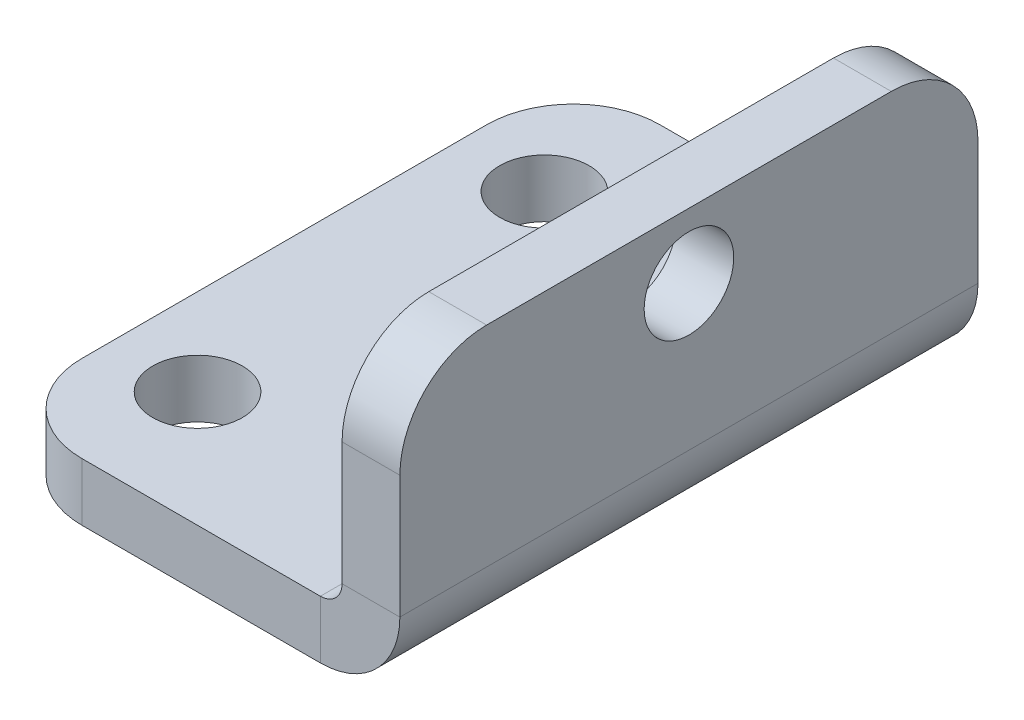
ISO-10303-21;
HEADER;
FILE_DESCRIPTION(('STEP AP214'),'2;1');
FILE_NAME('part.step','',(''),(''),'','','');
FILE_SCHEMA(('AUTOMOTIVE_DESIGN { 1 0 10303 214 1 1 1 1 }'));
ENDSEC;
DATA;
#1=APPLICATION_CONTEXT('core data for automotive mechanical design processes');
#2=APPLICATION_PROTOCOL_DEFINITION('international standard','automotive_design',2000,#1);
#3=PRODUCT_CONTEXT('',#1,'mechanical');
#4=PRODUCT('Part','Part','',(#3));
#5=PRODUCT_RELATED_PRODUCT_CATEGORY('part','',(#4));
#6=PRODUCT_DEFINITION_FORMATION('','',#4);
#7=PRODUCT_DEFINITION_CONTEXT('part definition',#1,'design');
#8=PRODUCT_DEFINITION('design','',#6,#7);
#9=PRODUCT_DEFINITION_SHAPE('','',#8);
#10=(LENGTH_UNIT() NAMED_UNIT(*) SI_UNIT(.MILLI.,.METRE.));
#11=(NAMED_UNIT(*) PLANE_ANGLE_UNIT() SI_UNIT($,.RADIAN.));
#12=(NAMED_UNIT(*) SI_UNIT($,.STERADIAN.) SOLID_ANGLE_UNIT());
#13=UNCERTAINTY_MEASURE_WITH_UNIT(LENGTH_MEASURE(1.E-05),#10,'distance_accuracy_value','');
#14=(GEOMETRIC_REPRESENTATION_CONTEXT(3) GLOBAL_UNCERTAINTY_ASSIGNED_CONTEXT((#13)) GLOBAL_UNIT_ASSIGNED_CONTEXT((#10,
#11,#12)) REPRESENTATION_CONTEXT('',''));
#15=CARTESIAN_POINT('',(0.,0.,0.));
#16=DIRECTION('',(0.,0.,1.));
#17=DIRECTION('',(1.,0.,0.));
#18=AXIS2_PLACEMENT_3D('',#15,#16,#17);
#19=CARTESIAN_POINT('',(0.,0.75,10.));
#20=DIRECTION('',(0.,0.,1.));
#21=DIRECTION('',(1.,0.,0.));
#22=AXIS2_PLACEMENT_3D('',#19,#20,#21);
#23=PLANE('',#22);
#24=DIRECTION('',(1.,0.,0.));
#25=VECTOR('',#24,1.);
#26=CARTESIAN_POINT('',(0.,0.75,10.));
#27=LINE('',#26,#25);
#28=CARTESIAN_POINT('',(0.,0.75,10.));
#29=VERTEX_POINT('',#28);
#30=CARTESIAN_POINT('',(2.,0.75,10.));
#31=VERTEX_POINT('',#30);
#32=EDGE_CURVE('E140',#29,#31,#27,.T.);
#33=ORIENTED_EDGE('',*,*,#32,.F.);
#34=CARTESIAN_POINT('',(-0.75,0.75,10.));
#35=DIRECTION('',(0.,0.,-1.));
#36=DIRECTION('',(-1.,0.,0.));
#37=AXIS2_PLACEMENT_3D('',#34,#35,#36);
#38=CIRCLE('',#37,0.75);
#39=CARTESIAN_POINT('',(-0.750000000000001,0.,10.));
#40=VERTEX_POINT('',#39);
#41=EDGE_CURVE('E144',#40,#29,#38,.F.);
#42=ORIENTED_EDGE('',*,*,#41,.F.);
#43=DIRECTION('',(0.,1.,0.));
#44=VECTOR('',#43,1.);
#45=CARTESIAN_POINT('',(-0.750000000000001,-2.,10.));
#46=LINE('',#45,#44);
#47=CARTESIAN_POINT('',(-0.750000000000001,-2.,10.));
#48=VERTEX_POINT('',#47);
#49=EDGE_CURVE('E149',#48,#40,#46,.T.);
#50=ORIENTED_EDGE('',*,*,#49,.F.);
#51=CARTESIAN_POINT('',(-0.75,0.75,10.));
#52=DIRECTION('',(0.,0.,1.));
#53=DIRECTION('',(1.,0.,0.));
#54=AXIS2_PLACEMENT_3D('',#51,#52,#53);
#55=CIRCLE('',#54,2.75);
#56=EDGE_CURVE('E146',#48,#31,#55,.T.);
#57=ORIENTED_EDGE('',*,*,#56,.T.);
#58=EDGE_LOOP('',(#33,#42,#50,#57));
#59=FACE_BOUND('',#58,.T.);
#60=ADVANCED_FACE('F49',(#59),#23,.T.);
#61=CARTESIAN_POINT('',(-0.750000000000001,-2.,10.));
#62=DIRECTION('',(0.,0.,1.));
#63=DIRECTION('',(1.,0.,0.));
#64=AXIS2_PLACEMENT_3D('',#61,#62,#63);
#65=PLANE('',#64);
#66=DIRECTION('',(0.,1.,0.));
#67=VECTOR('',#66,1.);
#68=CARTESIAN_POINT('',(2.,0.,10.));
#69=LINE('',#68,#67);
#70=CARTESIAN_POINT('',(2.,5.,10.));
#71=VERTEX_POINT('',#70);
#72=EDGE_CURVE('E167',#31,#71,#69,.T.);
#73=ORIENTED_EDGE('',*,*,#72,.T.);
#74=DIRECTION('',(1.,0.,0.));
#75=VECTOR('',#74,1.);
#76=CARTESIAN_POINT('',(-0.750000000000001,5.,10.));
#77=LINE('',#76,#75);
#78=CARTESIAN_POINT('',(0.,5.,10.));
#79=VERTEX_POINT('',#78);
#80=EDGE_CURVE('E11',#71,#79,#77,.F.);
#81=ORIENTED_EDGE('',*,*,#80,.T.);
#82=DIRECTION('',(0.,1.,0.));
#83=VECTOR('',#82,1.);
#84=CARTESIAN_POINT('',(0.,0.,10.));
#85=LINE('',#84,#83);
#86=EDGE_CURVE('E156',#29,#79,#85,.T.);
#87=ORIENTED_EDGE('',*,*,#86,.F.);
#88=ORIENTED_EDGE('',*,*,#32,.T.);
#89=EDGE_LOOP('',(#73,#81,#87,#88));
#90=FACE_BOUND('',#89,.T.);
#91=ADVANCED_FACE('F166',(#90),#65,.T.);
#92=CARTESIAN_POINT('',(-0.750000000000001,0.,-10.));
#93=DIRECTION('',(0.,0.,-1.));
#94=DIRECTION('',(-1.,0.,0.));
#95=AXIS2_PLACEMENT_3D('',#92,#93,#94);
#96=PLANE('',#95);
#97=DIRECTION('',(0.,-1.,0.));
#98=VECTOR('',#97,1.);
#99=CARTESIAN_POINT('',(-0.750000000000001,0.,-10.));
#100=LINE('',#99,#98);
#101=CARTESIAN_POINT('',(-0.750000000000001,0.,-10.));
#102=VERTEX_POINT('',#101);
#103=CARTESIAN_POINT('',(-0.750000000000001,-2.,-10.));
#104=VERTEX_POINT('',#103);
#105=EDGE_CURVE('E212',#102,#104,#100,.T.);
#106=ORIENTED_EDGE('',*,*,#105,.F.);
#107=CARTESIAN_POINT('',(-0.75,0.75,-10.));
#108=DIRECTION('',(0.,0.,-1.));
#109=DIRECTION('',(-1.,0.,0.));
#110=AXIS2_PLACEMENT_3D('',#107,#108,#109);
#111=CIRCLE('',#110,0.75);
#112=CARTESIAN_POINT('',(0.,0.75,-10.));
#113=VERTEX_POINT('',#112);
#114=EDGE_CURVE('E186',#102,#113,#111,.F.);
#115=ORIENTED_EDGE('',*,*,#114,.T.);
#116=DIRECTION('',(-1.,0.,0.));
#117=VECTOR('',#116,1.);
#118=CARTESIAN_POINT('',(2.,0.75,-10.));
#119=LINE('',#118,#117);
#120=CARTESIAN_POINT('',(2.,0.75,-10.));
#121=VERTEX_POINT('',#120);
#122=EDGE_CURVE('E210',#121,#113,#119,.T.);
#123=ORIENTED_EDGE('',*,*,#122,.F.);
#124=CARTESIAN_POINT('',(-0.75,0.75,-10.));
#125=DIRECTION('',(0.,0.,1.));
#126=DIRECTION('',(1.,0.,0.));
#127=AXIS2_PLACEMENT_3D('',#124,#125,#126);
#128=CIRCLE('',#127,2.75);
#129=EDGE_CURVE('E192',#104,#121,#128,.T.);
#130=ORIENTED_EDGE('',*,*,#129,.F.);
#131=EDGE_LOOP('',(#106,#115,#123,#130));
#132=FACE_BOUND('',#131,.T.);
#133=ADVANCED_FACE('F303',(#132),#96,.T.);
#134=CARTESIAN_POINT('',(2.,0.75,-10.));
#135=DIRECTION('',(0.,0.,-1.));
#136=DIRECTION('',(-1.,0.,0.));
#137=AXIS2_PLACEMENT_3D('',#134,#135,#136);
#138=PLANE('',#137);
#139=DIRECTION('',(1.,0.,0.));
#140=VECTOR('',#139,1.);
#141=CARTESIAN_POINT('',(-12.,-2.,-10.));
#142=LINE('',#141,#140);
#143=CARTESIAN_POINT('',(-9.,-2.,-10.));
#144=VERTEX_POINT('',#143);
#145=EDGE_CURVE('E190',#144,#104,#142,.T.);
#146=ORIENTED_EDGE('',*,*,#145,.F.);
#147=DIRECTION('',(0.,1.,0.));
#148=VECTOR('',#147,1.);
#149=CARTESIAN_POINT('',(-9.,0.75,-10.));
#150=LINE('',#149,#148);
#151=CARTESIAN_POINT('',(-9.,0.,-10.));
#152=VERTEX_POINT('',#151);
#153=EDGE_CURVE('E231',#144,#152,#150,.T.);
#154=ORIENTED_EDGE('',*,*,#153,.T.);
#155=DIRECTION('',(1.,0.,0.));
#156=VECTOR('',#155,1.);
#157=CARTESIAN_POINT('',(-12.,0.,-10.));
#158=LINE('',#157,#156);
#159=EDGE_CURVE('E188',#152,#102,#158,.T.);
#160=ORIENTED_EDGE('',*,*,#159,.T.);
#161=ORIENTED_EDGE('',*,*,#105,.T.);
#162=EDGE_LOOP('',(#146,#154,#160,#161));
#163=FACE_BOUND('',#162,.T.);
#164=ADVANCED_FACE('F371',(#163),#138,.T.);
#165=CARTESIAN_POINT('',(2.,0.,10.));
#166=DIRECTION('',(-1.,0.,0.));
#167=DIRECTION('',(0.,0.,1.));
#168=AXIS2_PLACEMENT_3D('',#165,#166,#167);
#169=PLANE('',#168);
#170=CARTESIAN_POINT('',(2.,5.74999999999999,0.));
#171=DIRECTION('',(-1.,0.,0.));
#172=DIRECTION('',(0.,0.,1.));
#173=AXIS2_PLACEMENT_3D('',#170,#171,#172);
#174=CIRCLE('',#173,1.55);
#175=CARTESIAN_POINT('',(2.,5.74999999999999,1.54999999999996));
#176=VERTEX_POINT('',#175);
#177=EDGE_CURVE('E265',#176,#176,#174,.T.);
#178=ORIENTED_EDGE('',*,*,#177,.T.);
#179=EDGE_LOOP('',(#178));
#180=FACE_BOUND('',#179,.T.);
#181=DIRECTION('',(0.,1.,0.));
#182=VECTOR('',#181,1.);
#183=CARTESIAN_POINT('',(2.,0.,-10.));
#184=LINE('',#183,#182);
#185=CARTESIAN_POINT('',(2.,5.,-10.));
#186=VERTEX_POINT('',#185);
#187=EDGE_CURVE('E181',#121,#186,#184,.T.);
#188=ORIENTED_EDGE('',*,*,#187,.T.);
#189=CARTESIAN_POINT('',(2.,5.,-7.));
#190=DIRECTION('',(-1.,0.,0.));
#191=DIRECTION('',(0.,0.,1.));
#192=AXIS2_PLACEMENT_3D('',#189,#190,#191);
#193=CIRCLE('',#192,3.);
#194=CARTESIAN_POINT('',(2.,8.,-7.));
#195=VERTEX_POINT('',#194);
#196=EDGE_CURVE('E239',#186,#195,#193,.F.);
#197=ORIENTED_EDGE('',*,*,#196,.T.);
#198=DIRECTION('',(0.,0.,-1.));
#199=VECTOR('',#198,1.);
#200=CARTESIAN_POINT('',(2.,8.,10.));
#201=LINE('',#200,#199);
#202=CARTESIAN_POINT('',(2.,8.,7.));
#203=VERTEX_POINT('',#202);
#204=EDGE_CURVE('E208',#203,#195,#201,.T.);
#205=ORIENTED_EDGE('',*,*,#204,.F.);
#206=CARTESIAN_POINT('',(2.,5.,7.));
#207=DIRECTION('',(-1.,0.,0.));
#208=DIRECTION('',(0.,0.,1.));
#209=AXIS2_PLACEMENT_3D('',#206,#207,#208);
#210=CIRCLE('',#209,3.);
#211=EDGE_CURVE('E237',#203,#71,#210,.F.);
#212=ORIENTED_EDGE('',*,*,#211,.T.);
#213=ORIENTED_EDGE('',*,*,#72,.F.);
#214=DIRECTION('',(0.,0.,-1.));
#215=VECTOR('',#214,1.);
#216=CARTESIAN_POINT('',(2.,0.75,10.));
#217=LINE('',#216,#215);
#218=EDGE_CURVE('E180',#31,#121,#217,.T.);
#219=ORIENTED_EDGE('',*,*,#218,.T.);
#220=EDGE_LOOP('',(#188,#197,#205,#212,#213,#219));
#221=FACE_BOUND('',#220,.T.);
#222=ADVANCED_FACE('F255',(#180,#221),#169,.F.);
#223=CARTESIAN_POINT('',(0.,8.,10.));
#224=DIRECTION('',(0.,1.,0.));
#225=DIRECTION('',(0.,0.,1.));
#226=AXIS2_PLACEMENT_3D('',#223,#224,#225);
#227=PLANE('',#226);
#228=ORIENTED_EDGE('',*,*,#204,.T.);
#229=DIRECTION('',(1.,0.,0.));
#230=VECTOR('',#229,1.);
#231=CARTESIAN_POINT('',(0.,8.,-7.));
#232=LINE('',#231,#230);
#233=CARTESIAN_POINT('',(0.,8.,-7.));
#234=VERTEX_POINT('',#233);
#235=EDGE_CURVE('E70',#195,#234,#232,.F.);
#236=ORIENTED_EDGE('',*,*,#235,.T.);
#237=DIRECTION('',(0.,0.,-1.));
#238=VECTOR('',#237,1.);
#239=CARTESIAN_POINT('',(0.,8.,10.));
#240=LINE('',#239,#238);
#241=CARTESIAN_POINT('',(0.,8.,7.));
#242=VERTEX_POINT('',#241);
#243=EDGE_CURVE('E163',#242,#234,#240,.T.);
#244=ORIENTED_EDGE('',*,*,#243,.F.);
#245=DIRECTION('',(1.,0.,0.));
#246=VECTOR('',#245,1.);
#247=CARTESIAN_POINT('',(0.,8.,7.));
#248=LINE('',#247,#246);
#249=EDGE_CURVE('E241',#242,#203,#248,.T.);
#250=ORIENTED_EDGE('',*,*,#249,.T.);
#251=EDGE_LOOP('',(#228,#236,#244,#250));
#252=FACE_BOUND('',#251,.T.);
#253=ADVANCED_FACE('F256',(#252),#227,.T.);
#254=CARTESIAN_POINT('',(0.,0.,10.));
#255=DIRECTION('',(-1.,0.,0.));
#256=DIRECTION('',(0.,0.,1.));
#257=AXIS2_PLACEMENT_3D('',#254,#255,#256);
#258=PLANE('',#257);
#259=CARTESIAN_POINT('',(0.,5.74999999999999,0.));
#260=DIRECTION('',(-1.,0.,0.));
#261=DIRECTION('',(0.,0.,1.));
#262=AXIS2_PLACEMENT_3D('',#259,#260,#261);
#263=CIRCLE('',#262,1.55);
#264=CARTESIAN_POINT('',(0.,5.74999999999999,1.54999999999996));
#265=VERTEX_POINT('',#264);
#266=EDGE_CURVE('E273',#265,#265,#263,.T.);
#267=ORIENTED_EDGE('',*,*,#266,.F.);
#268=EDGE_LOOP('',(#267));
#269=FACE_BOUND('',#268,.T.);
#270=ORIENTED_EDGE('',*,*,#243,.T.);
#271=CARTESIAN_POINT('',(0.,5.,-7.));
#272=DIRECTION('',(-1.,0.,0.));
#273=DIRECTION('',(0.,0.,1.));
#274=AXIS2_PLACEMENT_3D('',#271,#272,#273);
#275=CIRCLE('',#274,3.);
#276=CARTESIAN_POINT('',(0.,5.,-10.));
#277=VERTEX_POINT('',#276);
#278=EDGE_CURVE('E57',#234,#277,#275,.T.);
#279=ORIENTED_EDGE('',*,*,#278,.T.);
#280=DIRECTION('',(0.,1.,0.));
#281=VECTOR('',#280,1.);
#282=CARTESIAN_POINT('',(0.,0.,-10.));
#283=LINE('',#282,#281);
#284=EDGE_CURVE('E159',#113,#277,#283,.T.);
#285=ORIENTED_EDGE('',*,*,#284,.F.);
#286=DIRECTION('',(0.,0.,-1.));
#287=VECTOR('',#286,1.);
#288=CARTESIAN_POINT('',(0.,0.75,10.));
#289=LINE('',#288,#287);
#290=EDGE_CURVE('E154',#29,#113,#289,.T.);
#291=ORIENTED_EDGE('',*,*,#290,.F.);
#292=ORIENTED_EDGE('',*,*,#86,.T.);
#293=CARTESIAN_POINT('',(0.,5.,7.));
#294=DIRECTION('',(-1.,0.,0.));
#295=DIRECTION('',(0.,0.,1.));
#296=AXIS2_PLACEMENT_3D('',#293,#294,#295);
#297=CIRCLE('',#296,3.);
#298=EDGE_CURVE('E245',#79,#242,#297,.T.);
#299=ORIENTED_EDGE('',*,*,#298,.T.);
#300=EDGE_LOOP('',(#270,#279,#285,#291,#292,#299));
#301=FACE_BOUND('',#300,.T.);
#302=ADVANCED_FACE('F155',(#269,#301),#258,.T.);
#303=CARTESIAN_POINT('',(-0.75,0.75,10.));
#304=DIRECTION('',(0.,0.,-1.));
#305=DIRECTION('',(-1.,0.,0.));
#306=AXIS2_PLACEMENT_3D('',#303,#304,#305);
#307=CYLINDRICAL_SURFACE('',#306,0.75);
#308=ORIENTED_EDGE('',*,*,#114,.F.);
#309=DIRECTION('',(0.,0.,-1.));
#310=VECTOR('',#309,1.);
#311=CARTESIAN_POINT('',(-0.750000000000001,0.,10.));
#312=LINE('',#311,#310);
#313=EDGE_CURVE('E164',#40,#102,#312,.T.);
#314=ORIENTED_EDGE('',*,*,#313,.F.);
#315=ORIENTED_EDGE('',*,*,#41,.T.);
#316=ORIENTED_EDGE('',*,*,#290,.T.);
#317=EDGE_LOOP('',(#308,#314,#315,#316));
#318=FACE_BOUND('',#317,.T.);
#319=ADVANCED_FACE('F170',(#318),#307,.F.);
#320=CARTESIAN_POINT('',(-12.,0.,10.));
#321=DIRECTION('',(0.,1.,0.));
#322=DIRECTION('',(0.,0.,1.));
#323=AXIS2_PLACEMENT_3D('',#320,#321,#322);
#324=PLANE('',#323);
#325=CARTESIAN_POINT('',(-9.,0.,-6.));
#326=DIRECTION('',(0.,1.,0.));
#327=DIRECTION('',(0.,0.,1.));
#328=AXIS2_PLACEMENT_3D('',#325,#326,#327);
#329=CIRCLE('',#328,1.55);
#330=CARTESIAN_POINT('',(-9.,0.,-4.45));
#331=VERTEX_POINT('',#330);
#332=EDGE_CURVE('E268',#331,#331,#329,.T.);
#333=ORIENTED_EDGE('',*,*,#332,.F.);
#334=EDGE_LOOP('',(#333));
#335=FACE_BOUND('',#334,.T.);
#336=CARTESIAN_POINT('',(-9.,0.,6.));
#337=DIRECTION('',(0.,1.,0.));
#338=DIRECTION('',(0.,0.,-1.));
#339=AXIS2_PLACEMENT_3D('',#336,#337,#338);
#340=CIRCLE('',#339,1.55);
#341=CARTESIAN_POINT('',(-9.,0.,4.45));
#342=VERTEX_POINT('',#341);
#343=EDGE_CURVE('E261',#342,#342,#340,.T.);
#344=ORIENTED_EDGE('',*,*,#343,.F.);
#345=EDGE_LOOP('',(#344));
#346=FACE_BOUND('',#345,.T.);
#347=DIRECTION('',(0.,0.,-1.));
#348=VECTOR('',#347,1.);
#349=CARTESIAN_POINT('',(-12.,0.,10.));
#350=LINE('',#349,#348);
#351=CARTESIAN_POINT('',(-12.,0.,7.));
#352=VERTEX_POINT('',#351);
#353=CARTESIAN_POINT('',(-12.,0.,-7.));
#354=VERTEX_POINT('',#353);
#355=EDGE_CURVE('E203',#352,#354,#350,.T.);
#356=ORIENTED_EDGE('',*,*,#355,.F.);
#357=CARTESIAN_POINT('',(-9.,0.,7.));
#358=DIRECTION('',(0.,1.,0.));
#359=DIRECTION('',(0.,0.,1.));
#360=AXIS2_PLACEMENT_3D('',#357,#358,#359);
#361=CIRCLE('',#360,3.);
#362=CARTESIAN_POINT('',(-9.,0.,10.));
#363=VERTEX_POINT('',#362);
#364=EDGE_CURVE('E223',#352,#363,#361,.T.);
#365=ORIENTED_EDGE('',*,*,#364,.T.);
#366=DIRECTION('',(1.,0.,0.));
#367=VECTOR('',#366,1.);
#368=CARTESIAN_POINT('',(-12.,0.,10.));
#369=LINE('',#368,#367);
#370=EDGE_CURVE('E172',#363,#40,#369,.T.);
#371=ORIENTED_EDGE('',*,*,#370,.T.);
#372=ORIENTED_EDGE('',*,*,#313,.T.);
#373=ORIENTED_EDGE('',*,*,#159,.F.);
#374=CARTESIAN_POINT('',(-9.,0.,-7.));
#375=DIRECTION('',(0.,1.,0.));
#376=DIRECTION('',(0.,0.,1.));
#377=AXIS2_PLACEMENT_3D('',#374,#375,#376);
#378=CIRCLE('',#377,3.);
#379=EDGE_CURVE('E221',#152,#354,#378,.T.);
#380=ORIENTED_EDGE('',*,*,#379,.T.);
#381=EDGE_LOOP('',(#356,#365,#371,#372,#373,#380));
#382=FACE_BOUND('',#381,.T.);
#383=ADVANCED_FACE('F293',(#335,#346,#382),#324,.T.);
#384=CARTESIAN_POINT('',(-12.,-2.,10.));
#385=DIRECTION('',(-1.,0.,0.));
#386=DIRECTION('',(0.,0.,1.));
#387=AXIS2_PLACEMENT_3D('',#384,#385,#386);
#388=PLANE('',#387);
#389=DIRECTION('',(0.,0.,-1.));
#390=VECTOR('',#389,1.);
#391=CARTESIAN_POINT('',(-12.,-2.,10.));
#392=LINE('',#391,#390);
#393=CARTESIAN_POINT('',(-12.,-2.,7.));
#394=VERTEX_POINT('',#393);
#395=CARTESIAN_POINT('',(-12.,-2.,-7.));
#396=VERTEX_POINT('',#395);
#397=EDGE_CURVE('E200',#394,#396,#392,.T.);
#398=ORIENTED_EDGE('',*,*,#397,.F.);
#399=DIRECTION('',(0.,1.,0.));
#400=VECTOR('',#399,1.);
#401=CARTESIAN_POINT('',(-12.,0.,7.));
#402=LINE('',#401,#400);
#403=EDGE_CURVE('E218',#394,#352,#402,.T.);
#404=ORIENTED_EDGE('',*,*,#403,.T.);
#405=ORIENTED_EDGE('',*,*,#355,.T.);
#406=DIRECTION('',(0.,1.,0.));
#407=VECTOR('',#406,1.);
#408=CARTESIAN_POINT('',(-12.,-2.,-7.));
#409=LINE('',#408,#407);
#410=EDGE_CURVE('E148',#354,#396,#409,.F.);
#411=ORIENTED_EDGE('',*,*,#410,.T.);
#412=EDGE_LOOP('',(#398,#404,#405,#411));
#413=FACE_BOUND('',#412,.T.);
#414=ADVANCED_FACE('F346',(#413),#388,.T.);
#415=CARTESIAN_POINT('',(-12.,-2.,10.));
#416=DIRECTION('',(0.,1.,0.));
#417=DIRECTION('',(0.,0.,1.));
#418=AXIS2_PLACEMENT_3D('',#415,#416,#417);
#419=PLANE('',#418);
#420=CARTESIAN_POINT('',(-9.,-2.,-6.));
#421=DIRECTION('',(0.,1.,0.));
#422=DIRECTION('',(0.,0.,1.));
#423=AXIS2_PLACEMENT_3D('',#420,#421,#422);
#424=CIRCLE('',#423,1.55);
#425=CARTESIAN_POINT('',(-9.,-2.,-4.45));
#426=VERTEX_POINT('',#425);
#427=EDGE_CURVE('E184',#426,#426,#424,.T.);
#428=ORIENTED_EDGE('',*,*,#427,.T.);
#429=EDGE_LOOP('',(#428));
#430=FACE_BOUND('',#429,.T.);
#431=CARTESIAN_POINT('',(-9.,-2.,6.));
#432=DIRECTION('',(0.,1.,0.));
#433=DIRECTION('',(0.,0.,-1.));
#434=AXIS2_PLACEMENT_3D('',#431,#432,#433);
#435=CIRCLE('',#434,1.55);
#436=CARTESIAN_POINT('',(-9.,-2.,4.45));
#437=VERTEX_POINT('',#436);
#438=EDGE_CURVE('E264',#437,#437,#435,.T.);
#439=ORIENTED_EDGE('',*,*,#438,.T.);
#440=EDGE_LOOP('',(#439));
#441=FACE_BOUND('',#440,.T.);
#442=DIRECTION('',(1.,0.,0.));
#443=VECTOR('',#442,1.);
#444=CARTESIAN_POINT('',(-12.,-2.,10.));
#445=LINE('',#444,#443);
#446=CARTESIAN_POINT('',(-9.,-2.,10.));
#447=VERTEX_POINT('',#446);
#448=EDGE_CURVE('E174',#447,#48,#445,.T.);
#449=ORIENTED_EDGE('',*,*,#448,.F.);
#450=CARTESIAN_POINT('',(-9.,-2.,7.));
#451=DIRECTION('',(0.,1.,0.));
#452=DIRECTION('',(0.,0.,1.));
#453=AXIS2_PLACEMENT_3D('',#450,#451,#452);
#454=CIRCLE('',#453,3.);
#455=EDGE_CURVE('E229',#447,#394,#454,.F.);
#456=ORIENTED_EDGE('',*,*,#455,.T.);
#457=ORIENTED_EDGE('',*,*,#397,.T.);
#458=CARTESIAN_POINT('',(-9.,-2.,-7.));
#459=DIRECTION('',(0.,1.,0.));
#460=DIRECTION('',(0.,0.,1.));
#461=AXIS2_PLACEMENT_3D('',#458,#459,#460);
#462=CIRCLE('',#461,3.);
#463=EDGE_CURVE('E227',#396,#144,#462,.F.);
#464=ORIENTED_EDGE('',*,*,#463,.T.);
#465=ORIENTED_EDGE('',*,*,#145,.T.);
#466=DIRECTION('',(0.,0.,-1.));
#467=VECTOR('',#466,1.);
#468=CARTESIAN_POINT('',(-0.750000000000001,-2.,10.));
#469=LINE('',#468,#467);
#470=EDGE_CURVE('E197',#48,#104,#469,.T.);
#471=ORIENTED_EDGE('',*,*,#470,.F.);
#472=EDGE_LOOP('',(#449,#456,#457,#464,#465,#471));
#473=FACE_BOUND('',#472,.T.);
#474=ADVANCED_FACE('F343',(#430,#441,#473),#419,.F.);
#475=CARTESIAN_POINT('',(-0.75,0.75,10.));
#476=DIRECTION('',(0.,0.,-1.));
#477=DIRECTION('',(-1.,0.,0.));
#478=AXIS2_PLACEMENT_3D('',#475,#476,#477);
#479=CYLINDRICAL_SURFACE('',#478,2.75);
#480=ORIENTED_EDGE('',*,*,#129,.T.);
#481=ORIENTED_EDGE('',*,*,#218,.F.);
#482=ORIENTED_EDGE('',*,*,#56,.F.);
#483=ORIENTED_EDGE('',*,*,#470,.T.);
#484=EDGE_LOOP('',(#480,#481,#482,#483));
#485=FACE_BOUND('',#484,.T.);
#486=ADVANCED_FACE('F337',(#485),#479,.T.);
#487=CARTESIAN_POINT('',(-0.75,0.75,10.));
#488=DIRECTION('',(0.,0.,-1.));
#489=DIRECTION('',(-1.,0.,0.));
#490=AXIS2_PLACEMENT_3D('',#487,#488,#489);
#491=PLANE('',#490);
#492=ORIENTED_EDGE('',*,*,#370,.F.);
#493=DIRECTION('',(0.,1.,0.));
#494=VECTOR('',#493,1.);
#495=CARTESIAN_POINT('',(-9.,-2.,10.));
#496=LINE('',#495,#494);
#497=EDGE_CURVE('E225',#363,#447,#496,.F.);
#498=ORIENTED_EDGE('',*,*,#497,.T.);
#499=ORIENTED_EDGE('',*,*,#448,.T.);
#500=ORIENTED_EDGE('',*,*,#49,.T.);
#501=EDGE_LOOP('',(#492,#498,#499,#500));
#502=FACE_BOUND('',#501,.T.);
#503=ADVANCED_FACE('F334',(#502),#491,.F.);
#504=CARTESIAN_POINT('',(-0.75,0.75,-10.));
#505=DIRECTION('',(0.,0.,-1.));
#506=DIRECTION('',(-1.,0.,0.));
#507=AXIS2_PLACEMENT_3D('',#504,#505,#506);
#508=PLANE('',#507);
#509=ORIENTED_EDGE('',*,*,#284,.T.);
#510=DIRECTION('',(1.,0.,0.));
#511=VECTOR('',#510,1.);
#512=CARTESIAN_POINT('',(-0.75,5.,-10.));
#513=LINE('',#512,#511);
#514=EDGE_CURVE('E234',#277,#186,#513,.T.);
#515=ORIENTED_EDGE('',*,*,#514,.T.);
#516=ORIENTED_EDGE('',*,*,#187,.F.);
#517=ORIENTED_EDGE('',*,*,#122,.T.);
#518=EDGE_LOOP('',(#509,#515,#516,#517));
#519=FACE_BOUND('',#518,.T.);
#520=ADVANCED_FACE('F250',(#519),#508,.T.);
#521=CARTESIAN_POINT('',(-9.,-2.,7.));
#522=DIRECTION('',(0.,-1.,0.));
#523=DIRECTION('',(0.,0.,-1.));
#524=AXIS2_PLACEMENT_3D('',#521,#522,#523);
#525=CYLINDRICAL_SURFACE('',#524,3.);
#526=ORIENTED_EDGE('',*,*,#455,.F.);
#527=ORIENTED_EDGE('',*,*,#497,.F.);
#528=ORIENTED_EDGE('',*,*,#364,.F.);
#529=ORIENTED_EDGE('',*,*,#403,.F.);
#530=EDGE_LOOP('',(#526,#527,#528,#529));
#531=FACE_BOUND('',#530,.T.);
#532=ADVANCED_FACE('F307',(#531),#525,.T.);
#533=CARTESIAN_POINT('',(-9.,0.75,-7.));
#534=DIRECTION('',(0.,1.,0.));
#535=DIRECTION('',(0.,0.,1.));
#536=AXIS2_PLACEMENT_3D('',#533,#534,#535);
#537=CYLINDRICAL_SURFACE('',#536,3.);
#538=ORIENTED_EDGE('',*,*,#463,.F.);
#539=ORIENTED_EDGE('',*,*,#410,.F.);
#540=ORIENTED_EDGE('',*,*,#379,.F.);
#541=ORIENTED_EDGE('',*,*,#153,.F.);
#542=EDGE_LOOP('',(#538,#539,#540,#541));
#543=FACE_BOUND('',#542,.T.);
#544=ADVANCED_FACE('F310',(#543),#537,.T.);
#545=CARTESIAN_POINT('',(-0.75,5.,-7.));
#546=DIRECTION('',(1.,0.,0.));
#547=DIRECTION('',(0.,0.,-1.));
#548=AXIS2_PLACEMENT_3D('',#545,#546,#547);
#549=CYLINDRICAL_SURFACE('',#548,3.);
#550=ORIENTED_EDGE('',*,*,#278,.F.);
#551=ORIENTED_EDGE('',*,*,#235,.F.);
#552=ORIENTED_EDGE('',*,*,#196,.F.);
#553=ORIENTED_EDGE('',*,*,#514,.F.);
#554=EDGE_LOOP('',(#550,#551,#552,#553));
#555=FACE_BOUND('',#554,.T.);
#556=ADVANCED_FACE('F252',(#555),#549,.T.);
#557=CARTESIAN_POINT('',(0.,5.,7.));
#558=DIRECTION('',(1.,0.,0.));
#559=DIRECTION('',(0.,0.,-1.));
#560=AXIS2_PLACEMENT_3D('',#557,#558,#559);
#561=CYLINDRICAL_SURFACE('',#560,3.);
#562=ORIENTED_EDGE('',*,*,#298,.F.);
#563=ORIENTED_EDGE('',*,*,#80,.F.);
#564=ORIENTED_EDGE('',*,*,#211,.F.);
#565=ORIENTED_EDGE('',*,*,#249,.F.);
#566=EDGE_LOOP('',(#562,#563,#564,#565));
#567=FACE_BOUND('',#566,.T.);
#568=ADVANCED_FACE('F51',(#567),#561,.T.);
#569=CARTESIAN_POINT('',(-9.,-2.,6.));
#570=DIRECTION('',(0.,1.,0.));
#571=DIRECTION('',(0.,0.,1.));
#572=AXIS2_PLACEMENT_3D('',#569,#570,#571);
#573=CYLINDRICAL_SURFACE('',#572,1.55);
#574=ORIENTED_EDGE('',*,*,#438,.F.);
#575=EDGE_LOOP('',(#574));
#576=FACE_BOUND('',#575,.T.);
#577=ORIENTED_EDGE('',*,*,#343,.T.);
#578=EDGE_LOOP('',(#577));
#579=FACE_BOUND('',#578,.T.);
#580=ADVANCED_FACE('F318',(#576,#579),#573,.F.);
#581=CARTESIAN_POINT('',(-9.,-2.,-6.));
#582=DIRECTION('',(0.,1.,0.));
#583=DIRECTION('',(0.,0.,1.));
#584=AXIS2_PLACEMENT_3D('',#581,#582,#583);
#585=CYLINDRICAL_SURFACE('',#584,1.55);
#586=ORIENTED_EDGE('',*,*,#427,.F.);
#587=EDGE_LOOP('',(#586));
#588=FACE_BOUND('',#587,.T.);
#589=ORIENTED_EDGE('',*,*,#332,.T.);
#590=EDGE_LOOP('',(#589));
#591=FACE_BOUND('',#590,.T.);
#592=ADVANCED_FACE('F283',(#588,#591),#585,.F.);
#593=CARTESIAN_POINT('',(2.,5.74999999999999,0.));
#594=DIRECTION('',(-1.,0.,0.));
#595=DIRECTION('',(0.,0.,1.));
#596=AXIS2_PLACEMENT_3D('',#593,#594,#595);
#597=CYLINDRICAL_SURFACE('',#596,1.55);
#598=ORIENTED_EDGE('',*,*,#177,.F.);
#599=EDGE_LOOP('',(#598));
#600=FACE_BOUND('',#599,.T.);
#601=ORIENTED_EDGE('',*,*,#266,.T.);
#602=EDGE_LOOP('',(#601));
#603=FACE_BOUND('',#602,.T.);
#604=ADVANCED_FACE('F280',(#600,#603),#597,.F.);
#605=CLOSED_SHELL('',(#60,#91,#133,#164,#222,#253,#302,#319,#383,#414,#474,#486,#503,#520,#532,
#544,#556,#568,#580,#592,#604));
#606=MANIFOLD_SOLID_BREP('B2',#605);
#607=ADVANCED_BREP_SHAPE_REPRESENTATION('',(#18,#606),#14);
#608=SHAPE_DEFINITION_REPRESENTATION(#9,#607);
ENDSEC;
END-ISO-10303-21;
